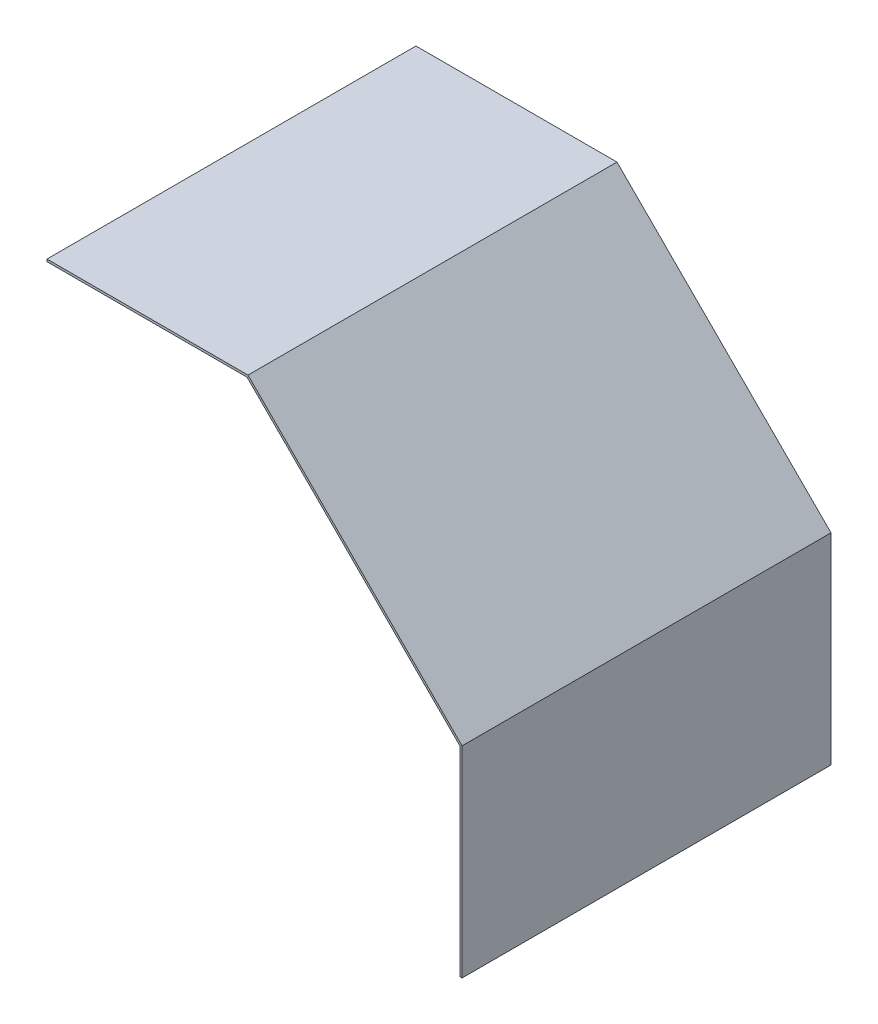
ISO-10303-21;
HEADER;
FILE_DESCRIPTION(('STEP AP214'),'2;1');
FILE_NAME('part.step','',(''),(''),'','','');
FILE_SCHEMA(('AUTOMOTIVE_DESIGN { 1 0 10303 214 1 1 1 1 }'));
ENDSEC;
DATA;
#1=APPLICATION_CONTEXT('core data for automotive mechanical design processes');
#2=APPLICATION_PROTOCOL_DEFINITION('international standard','automotive_design',2000,#1);
#3=PRODUCT_CONTEXT('',#1,'mechanical');
#4=PRODUCT('Part','Part','',(#3));
#5=PRODUCT_RELATED_PRODUCT_CATEGORY('part','',(#4));
#6=PRODUCT_DEFINITION_FORMATION('','',#4);
#7=PRODUCT_DEFINITION_CONTEXT('part definition',#1,'design');
#8=PRODUCT_DEFINITION('design','',#6,#7);
#9=PRODUCT_DEFINITION_SHAPE('','',#8);
#10=(LENGTH_UNIT() NAMED_UNIT(*) SI_UNIT(.MILLI.,.METRE.));
#11=(NAMED_UNIT(*) PLANE_ANGLE_UNIT() SI_UNIT($,.RADIAN.));
#12=(NAMED_UNIT(*) SI_UNIT($,.STERADIAN.) SOLID_ANGLE_UNIT());
#13=UNCERTAINTY_MEASURE_WITH_UNIT(LENGTH_MEASURE(1.E-05),#10,'distance_accuracy_value','');
#14=(GEOMETRIC_REPRESENTATION_CONTEXT(3) GLOBAL_UNCERTAINTY_ASSIGNED_CONTEXT((#13)) GLOBAL_UNIT_ASSIGNED_CONTEXT((#10,
#11,#12)) REPRESENTATION_CONTEXT('',''));
#15=CARTESIAN_POINT('',(0.,0.,0.));
#16=DIRECTION('',(0.,0.,1.));
#17=DIRECTION('',(1.,0.,0.));
#18=AXIS2_PLACEMENT_3D('',#15,#16,#17);
#19=CARTESIAN_POINT('',(44.75,21.7944947177034,40.));
#20=DIRECTION('',(1.,0.,0.));
#21=DIRECTION('',(0.,0.,-1.));
#22=AXIS2_PLACEMENT_3D('',#19,#20,#21);
#23=PLANE('',#22);
#24=DIRECTION('',(0.,1.,0.));
#25=VECTOR('',#24,1.);
#26=CARTESIAN_POINT('',(44.75,21.7944947177034,0.));
#27=LINE('',#26,#25);
#28=CARTESIAN_POINT('',(44.75,21.6909413271101,0.));
#29=VERTEX_POINT('',#28);
#30=CARTESIAN_POINT('',(44.75,0.,0.));
#31=VERTEX_POINT('',#30);
#32=EDGE_CURVE('E130',#29,#31,#27,.F.);
#33=ORIENTED_EDGE('',*,*,#32,.T.);
#34=DIRECTION('',(0.,0.,-1.));
#35=VECTOR('',#34,1.);
#36=CARTESIAN_POINT('',(44.75,0.,40.));
#37=LINE('',#36,#35);
#38=CARTESIAN_POINT('',(44.75,0.,40.));
#39=VERTEX_POINT('',#38);
#40=EDGE_CURVE('E11',#39,#31,#37,.T.);
#41=ORIENTED_EDGE('',*,*,#40,.F.);
#42=DIRECTION('',(0.,1.,0.));
#43=VECTOR('',#42,1.);
#44=CARTESIAN_POINT('',(44.75,21.7944947177034,40.));
#45=LINE('',#44,#43);
#46=CARTESIAN_POINT('',(44.75,21.6909413271101,40.));
#47=VERTEX_POINT('',#46);
#48=EDGE_CURVE('E88',#47,#39,#45,.F.);
#49=ORIENTED_EDGE('',*,*,#48,.F.);
#50=DIRECTION('',(0.,0.,-1.));
#51=VECTOR('',#50,1.);
#52=CARTESIAN_POINT('',(44.75,21.6909413271101,40.));
#53=LINE('',#52,#51);
#54=EDGE_CURVE('E129',#47,#29,#53,.T.);
#55=ORIENTED_EDGE('',*,*,#54,.T.);
#56=EDGE_LOOP('',(#33,#41,#49,#55));
#57=FACE_BOUND('',#56,.T.);
#58=ADVANCED_FACE('F33',(#57),#23,.F.);
#59=CARTESIAN_POINT('',(45.,0.,40.));
#60=DIRECTION('',(0.,-1.,0.));
#61=DIRECTION('',(0.,0.,-1.));
#62=AXIS2_PLACEMENT_3D('',#59,#60,#61);
#63=PLANE('',#62);
#64=DIRECTION('',(-1.,0.,0.));
#65=VECTOR('',#64,1.);
#66=CARTESIAN_POINT('',(45.,0.,0.));
#67=LINE('',#66,#65);
#68=CARTESIAN_POINT('',(45.,0.,0.));
#69=VERTEX_POINT('',#68);
#70=EDGE_CURVE('E133',#69,#31,#67,.T.);
#71=ORIENTED_EDGE('',*,*,#70,.F.);
#72=DIRECTION('',(0.,0.,-1.));
#73=VECTOR('',#72,1.);
#74=CARTESIAN_POINT('',(45.,0.,40.));
#75=LINE('',#74,#73);
#76=CARTESIAN_POINT('',(45.,0.,40.));
#77=VERTEX_POINT('',#76);
#78=EDGE_CURVE('E41',#77,#69,#75,.T.);
#79=ORIENTED_EDGE('',*,*,#78,.F.);
#80=DIRECTION('',(-1.,0.,0.));
#81=VECTOR('',#80,1.);
#82=CARTESIAN_POINT('',(45.,0.,40.));
#83=LINE('',#82,#81);
#84=EDGE_CURVE('E172',#77,#39,#83,.T.);
#85=ORIENTED_EDGE('',*,*,#84,.T.);
#86=ORIENTED_EDGE('',*,*,#40,.T.);
#87=EDGE_LOOP('',(#71,#79,#85,#86));
#88=FACE_BOUND('',#87,.T.);
#89=ADVANCED_FACE('F163',(#88),#63,.T.);
#90=CARTESIAN_POINT('',(45.,21.7944947177034,40.));
#91=DIRECTION('',(1.,0.,0.));
#92=DIRECTION('',(0.,0.,-1.));
#93=AXIS2_PLACEMENT_3D('',#90,#91,#92);
#94=PLANE('',#93);
#95=DIRECTION('',(0.,-1.,0.));
#96=VECTOR('',#95,1.);
#97=CARTESIAN_POINT('',(45.,21.7944947177034,0.));
#98=LINE('',#97,#96);
#99=CARTESIAN_POINT('',(45.,21.7944947177034,0.));
#100=VERTEX_POINT('',#99);
#101=EDGE_CURVE('E136',#100,#69,#98,.T.);
#102=ORIENTED_EDGE('',*,*,#101,.F.);
#103=DIRECTION('',(0.,0.,-1.));
#104=VECTOR('',#103,1.);
#105=CARTESIAN_POINT('',(45.,21.7944947177034,40.));
#106=LINE('',#105,#104);
#107=CARTESIAN_POINT('',(45.,21.7944947177034,40.));
#108=VERTEX_POINT('',#107);
#109=EDGE_CURVE('E153',#108,#100,#106,.T.);
#110=ORIENTED_EDGE('',*,*,#109,.F.);
#111=DIRECTION('',(0.,-1.,0.));
#112=VECTOR('',#111,1.);
#113=CARTESIAN_POINT('',(45.,21.7944947177034,40.));
#114=LINE('',#113,#112);
#115=EDGE_CURVE('E160',#108,#77,#114,.T.);
#116=ORIENTED_EDGE('',*,*,#115,.T.);
#117=ORIENTED_EDGE('',*,*,#78,.T.);
#118=EDGE_LOOP('',(#102,#110,#116,#117));
#119=FACE_BOUND('',#118,.T.);
#120=ADVANCED_FACE('F158',(#119),#94,.T.);
#121=CARTESIAN_POINT('',(21.7944947177034,45.,40.));
#122=DIRECTION('',(0.707106781186548,0.707106781186548,0.));
#123=DIRECTION('',(-0.707106781186548,0.707106781186548,0.));
#124=AXIS2_PLACEMENT_3D('',#121,#122,#123);
#125=PLANE('',#124);
#126=DIRECTION('',(0.707106781186547,-0.707106781186547,0.));
#127=VECTOR('',#126,1.);
#128=CARTESIAN_POINT('',(21.7944947177034,45.,0.));
#129=LINE('',#128,#127);
#130=CARTESIAN_POINT('',(21.7944947177034,45.,0.));
#131=VERTEX_POINT('',#130);
#132=EDGE_CURVE('E139',#131,#100,#129,.T.);
#133=ORIENTED_EDGE('',*,*,#132,.F.);
#134=DIRECTION('',(0.,0.,-1.));
#135=VECTOR('',#134,1.);
#136=CARTESIAN_POINT('',(21.7944947177034,45.,40.));
#137=LINE('',#136,#135);
#138=CARTESIAN_POINT('',(21.7944947177034,45.,40.));
#139=VERTEX_POINT('',#138);
#140=EDGE_CURVE('E151',#139,#131,#137,.T.);
#141=ORIENTED_EDGE('',*,*,#140,.F.);
#142=DIRECTION('',(0.707106781186547,-0.707106781186547,0.));
#143=VECTOR('',#142,1.);
#144=CARTESIAN_POINT('',(21.7944947177034,45.,40.));
#145=LINE('',#144,#143);
#146=EDGE_CURVE('E124',#139,#108,#145,.T.);
#147=ORIENTED_EDGE('',*,*,#146,.T.);
#148=ORIENTED_EDGE('',*,*,#109,.T.);
#149=EDGE_LOOP('',(#133,#141,#147,#148));
#150=FACE_BOUND('',#149,.T.);
#151=ADVANCED_FACE('F170',(#150),#125,.T.);
#152=CARTESIAN_POINT('',(0.,45.,40.));
#153=DIRECTION('',(0.,1.,0.));
#154=DIRECTION('',(0.,0.,1.));
#155=AXIS2_PLACEMENT_3D('',#152,#153,#154);
#156=PLANE('',#155);
#157=DIRECTION('',(1.,0.,0.));
#158=VECTOR('',#157,1.);
#159=CARTESIAN_POINT('',(0.,45.,0.));
#160=LINE('',#159,#158);
#161=CARTESIAN_POINT('',(0.,45.,0.));
#162=VERTEX_POINT('',#161);
#163=EDGE_CURVE('E142',#162,#131,#160,.T.);
#164=ORIENTED_EDGE('',*,*,#163,.F.);
#165=DIRECTION('',(0.,0.,-1.));
#166=VECTOR('',#165,1.);
#167=CARTESIAN_POINT('',(0.,45.,40.));
#168=LINE('',#167,#166);
#169=CARTESIAN_POINT('',(0.,45.,40.));
#170=VERTEX_POINT('',#169);
#171=EDGE_CURVE('E112',#170,#162,#168,.T.);
#172=ORIENTED_EDGE('',*,*,#171,.F.);
#173=DIRECTION('',(1.,0.,0.));
#174=VECTOR('',#173,1.);
#175=CARTESIAN_POINT('',(0.,45.,40.));
#176=LINE('',#175,#174);
#177=EDGE_CURVE('E122',#170,#139,#176,.T.);
#178=ORIENTED_EDGE('',*,*,#177,.T.);
#179=ORIENTED_EDGE('',*,*,#140,.T.);
#180=EDGE_LOOP('',(#164,#172,#178,#179));
#181=FACE_BOUND('',#180,.T.);
#182=ADVANCED_FACE('F177',(#181),#156,.T.);
#183=CARTESIAN_POINT('',(0.,44.75,40.));
#184=DIRECTION('',(-1.,0.,0.));
#185=DIRECTION('',(0.,0.,1.));
#186=AXIS2_PLACEMENT_3D('',#183,#184,#185);
#187=PLANE('',#186);
#188=DIRECTION('',(0.,1.,0.));
#189=VECTOR('',#188,1.);
#190=CARTESIAN_POINT('',(0.,44.75,0.));
#191=LINE('',#190,#189);
#192=CARTESIAN_POINT('',(0.,44.75,0.));
#193=VERTEX_POINT('',#192);
#194=EDGE_CURVE('E111',#193,#162,#191,.T.);
#195=ORIENTED_EDGE('',*,*,#194,.F.);
#196=DIRECTION('',(0.,0.,-1.));
#197=VECTOR('',#196,1.);
#198=CARTESIAN_POINT('',(0.,44.75,40.));
#199=LINE('',#198,#197);
#200=CARTESIAN_POINT('',(0.,44.75,40.));
#201=VERTEX_POINT('',#200);
#202=EDGE_CURVE('E105',#201,#193,#199,.T.);
#203=ORIENTED_EDGE('',*,*,#202,.F.);
#204=DIRECTION('',(0.,1.,0.));
#205=VECTOR('',#204,1.);
#206=CARTESIAN_POINT('',(0.,44.75,40.));
#207=LINE('',#206,#205);
#208=EDGE_CURVE('E109',#201,#170,#207,.T.);
#209=ORIENTED_EDGE('',*,*,#208,.T.);
#210=ORIENTED_EDGE('',*,*,#171,.T.);
#211=EDGE_LOOP('',(#195,#203,#209,#210));
#212=FACE_BOUND('',#211,.T.);
#213=ADVANCED_FACE('F107',(#212),#187,.T.);
#214=CARTESIAN_POINT('',(0.,44.75,40.));
#215=DIRECTION('',(0.,1.,0.));
#216=DIRECTION('',(0.,0.,1.));
#217=AXIS2_PLACEMENT_3D('',#214,#215,#216);
#218=PLANE('',#217);
#219=DIRECTION('',(1.,0.,0.));
#220=VECTOR('',#219,1.);
#221=CARTESIAN_POINT('',(0.,44.75,0.));
#222=LINE('',#221,#220);
#223=CARTESIAN_POINT('',(21.6909413271101,44.75,0.));
#224=VERTEX_POINT('',#223);
#225=EDGE_CURVE('E76',#193,#224,#222,.T.);
#226=ORIENTED_EDGE('',*,*,#225,.T.);
#227=DIRECTION('',(0.,0.,-1.));
#228=VECTOR('',#227,1.);
#229=CARTESIAN_POINT('',(21.6909413271101,44.75,40.));
#230=LINE('',#229,#228);
#231=CARTESIAN_POINT('',(21.6909413271101,44.75,40.));
#232=VERTEX_POINT('',#231);
#233=EDGE_CURVE('E113',#232,#224,#230,.T.);
#234=ORIENTED_EDGE('',*,*,#233,.F.);
#235=DIRECTION('',(1.,0.,0.));
#236=VECTOR('',#235,1.);
#237=CARTESIAN_POINT('',(0.,44.75,40.));
#238=LINE('',#237,#236);
#239=EDGE_CURVE('E115',#201,#232,#238,.T.);
#240=ORIENTED_EDGE('',*,*,#239,.F.);
#241=ORIENTED_EDGE('',*,*,#202,.T.);
#242=EDGE_LOOP('',(#226,#234,#240,#241));
#243=FACE_BOUND('',#242,.T.);
#244=ADVANCED_FACE('F116',(#243),#218,.F.);
#245=CARTESIAN_POINT('',(21.6177180224067,44.8232233047034,40.));
#246=DIRECTION('',(0.707106781186548,0.707106781186548,0.));
#247=DIRECTION('',(-0.707106781186548,0.707106781186548,0.));
#248=AXIS2_PLACEMENT_3D('',#245,#246,#247);
#249=PLANE('',#248);
#250=DIRECTION('',(0.707106781186548,-0.707106781186548,0.));
#251=VECTOR('',#250,1.);
#252=CARTESIAN_POINT('',(21.6177180224067,44.8232233047034,0.));
#253=LINE('',#252,#251);
#254=EDGE_CURVE('E82',#224,#29,#253,.T.);
#255=ORIENTED_EDGE('',*,*,#254,.T.);
#256=ORIENTED_EDGE('',*,*,#54,.F.);
#257=DIRECTION('',(0.707106781186548,-0.707106781186548,0.));
#258=VECTOR('',#257,1.);
#259=CARTESIAN_POINT('',(21.6177180224067,44.8232233047034,40.));
#260=LINE('',#259,#258);
#261=EDGE_CURVE('E49',#232,#47,#260,.T.);
#262=ORIENTED_EDGE('',*,*,#261,.F.);
#263=ORIENTED_EDGE('',*,*,#233,.T.);
#264=EDGE_LOOP('',(#255,#256,#262,#263));
#265=FACE_BOUND('',#264,.T.);
#266=ADVANCED_FACE('F179',(#265),#249,.F.);
#267=CARTESIAN_POINT('',(0.,0.,40.));
#268=DIRECTION('',(0.,0.,1.));
#269=DIRECTION('',(1.,0.,0.));
#270=AXIS2_PLACEMENT_3D('',#267,#268,#269);
#271=PLANE('',#270);
#272=ORIENTED_EDGE('',*,*,#48,.T.);
#273=ORIENTED_EDGE('',*,*,#84,.F.);
#274=ORIENTED_EDGE('',*,*,#115,.F.);
#275=ORIENTED_EDGE('',*,*,#146,.F.);
#276=ORIENTED_EDGE('',*,*,#177,.F.);
#277=ORIENTED_EDGE('',*,*,#208,.F.);
#278=ORIENTED_EDGE('',*,*,#239,.T.);
#279=ORIENTED_EDGE('',*,*,#261,.T.);
#280=EDGE_LOOP('',(#272,#273,#274,#275,#276,#277,#278,#279));
#281=FACE_BOUND('',#280,.T.);
#282=ADVANCED_FACE('F119',(#281),#271,.T.);
#283=CARTESIAN_POINT('',(0.,0.,0.));
#284=DIRECTION('',(0.,0.,1.));
#285=DIRECTION('',(1.,0.,0.));
#286=AXIS2_PLACEMENT_3D('',#283,#284,#285);
#287=PLANE('',#286);
#288=ORIENTED_EDGE('',*,*,#32,.F.);
#289=ORIENTED_EDGE('',*,*,#254,.F.);
#290=ORIENTED_EDGE('',*,*,#225,.F.);
#291=ORIENTED_EDGE('',*,*,#194,.T.);
#292=ORIENTED_EDGE('',*,*,#163,.T.);
#293=ORIENTED_EDGE('',*,*,#132,.T.);
#294=ORIENTED_EDGE('',*,*,#101,.T.);
#295=ORIENTED_EDGE('',*,*,#70,.T.);
#296=EDGE_LOOP('',(#288,#289,#290,#291,#292,#293,#294,#295));
#297=FACE_BOUND('',#296,.T.);
#298=ADVANCED_FACE('F166',(#297),#287,.F.);
#299=CLOSED_SHELL('',(#58,#89,#120,#151,#182,#213,#244,#266,#282,#298));
#300=MANIFOLD_SOLID_BREP('B2',#299);
#301=ADVANCED_BREP_SHAPE_REPRESENTATION('',(#18,#300),#14);
#302=SHAPE_DEFINITION_REPRESENTATION(#9,#301);
ENDSEC;
END-ISO-10303-21;
